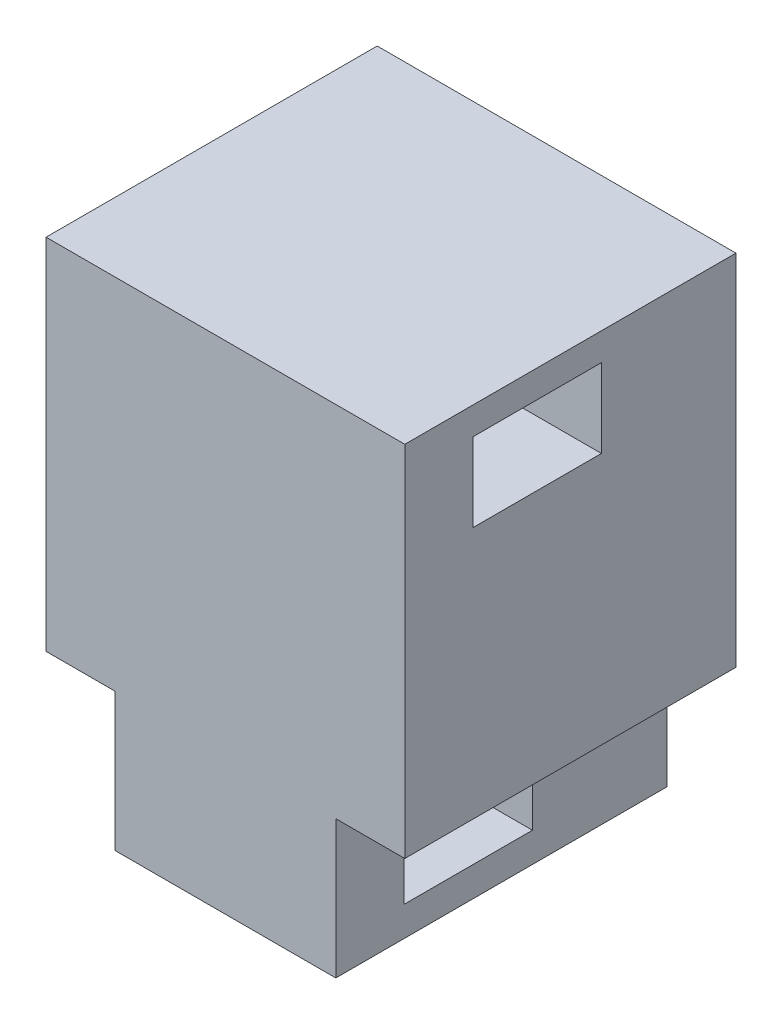
ISO-10303-21;
HEADER;
FILE_DESCRIPTION(('STEP AP214'),'2;1');
FILE_NAME('part.step','',(''),(''),'','','');
FILE_SCHEMA(('AUTOMOTIVE_DESIGN { 1 0 10303 214 1 1 1 1 }'));
ENDSEC;
DATA;
#1=APPLICATION_CONTEXT('core data for automotive mechanical design processes');
#2=APPLICATION_PROTOCOL_DEFINITION('international standard','automotive_design',2000,#1);
#3=PRODUCT_CONTEXT('',#1,'mechanical');
#4=PRODUCT('Part','Part','',(#3));
#5=PRODUCT_RELATED_PRODUCT_CATEGORY('part','',(#4));
#6=PRODUCT_DEFINITION_FORMATION('','',#4);
#7=PRODUCT_DEFINITION_CONTEXT('part definition',#1,'design');
#8=PRODUCT_DEFINITION('design','',#6,#7);
#9=PRODUCT_DEFINITION_SHAPE('','',#8);
#10=(LENGTH_UNIT() NAMED_UNIT(*) SI_UNIT(.MILLI.,.METRE.));
#11=(NAMED_UNIT(*) PLANE_ANGLE_UNIT() SI_UNIT($,.RADIAN.));
#12=(NAMED_UNIT(*) SI_UNIT($,.STERADIAN.) SOLID_ANGLE_UNIT());
#13=UNCERTAINTY_MEASURE_WITH_UNIT(LENGTH_MEASURE(1.E-05),#10,'distance_accuracy_value','');
#14=(GEOMETRIC_REPRESENTATION_CONTEXT(3) GLOBAL_UNCERTAINTY_ASSIGNED_CONTEXT((#13)) GLOBAL_UNIT_ASSIGNED_CONTEXT((#10,
#11,#12)) REPRESENTATION_CONTEXT('',''));
#15=CARTESIAN_POINT('',(0.,0.,0.));
#16=DIRECTION('',(0.,0.,1.));
#17=DIRECTION('',(1.,0.,0.));
#18=AXIS2_PLACEMENT_3D('',#15,#16,#17);
#19=CARTESIAN_POINT('',(65.,-65.,-120.));
#20=DIRECTION('',(1.,0.,0.));
#21=DIRECTION('',(0.,0.,-1.));
#22=AXIS2_PLACEMENT_3D('',#19,#20,#21);
#23=PLANE('',#22);
#24=DIRECTION('',(0.,1.,0.));
#25=VECTOR('',#24,1.);
#26=CARTESIAN_POINT('',(65.,-65.,0.));
#27=LINE('',#26,#25);
#28=CARTESIAN_POINT('',(65.,-65.,0.));
#29=VERTEX_POINT('',#28);
#30=CARTESIAN_POINT('',(65.,65.,0.));
#31=VERTEX_POINT('',#30);
#32=EDGE_CURVE('E410',#29,#31,#27,.T.);
#33=ORIENTED_EDGE('',*,*,#32,.F.);
#34=DIRECTION('',(0.,0.,1.));
#35=VECTOR('',#34,1.);
#36=CARTESIAN_POINT('',(65.,-65.,-120.));
#37=LINE('',#36,#35);
#38=CARTESIAN_POINT('',(65.,-65.,-120.));
#39=VERTEX_POINT('',#38);
#40=EDGE_CURVE('E11',#39,#29,#37,.T.);
#41=ORIENTED_EDGE('',*,*,#40,.F.);
#42=DIRECTION('',(0.,1.,0.));
#43=VECTOR('',#42,1.);
#44=CARTESIAN_POINT('',(65.,-65.,-120.));
#45=LINE('',#44,#43);
#46=CARTESIAN_POINT('',(65.,65.,-120.));
#47=VERTEX_POINT('',#46);
#48=EDGE_CURVE('E421',#39,#47,#45,.T.);
#49=ORIENTED_EDGE('',*,*,#48,.T.);
#50=DIRECTION('',(0.,0.,1.));
#51=VECTOR('',#50,1.);
#52=CARTESIAN_POINT('',(65.,65.,-120.));
#53=LINE('',#52,#51);
#54=EDGE_CURVE('E50',#47,#31,#53,.T.);
#55=ORIENTED_EDGE('',*,*,#54,.T.);
#56=EDGE_LOOP('',(#33,#41,#49,#55));
#57=FACE_BOUND('',#56,.T.);
#58=DIRECTION('',(0.,0.,-1.));
#59=VECTOR('',#58,1.);
#60=CARTESIAN_POINT('',(65.,55.,0.));
#61=LINE('',#60,#59);
#62=CARTESIAN_POINT('',(65.,55.,-24.7500000019928));
#63=VERTEX_POINT('',#62);
#64=CARTESIAN_POINT('',(65.,55.,-71.2500000019928));
#65=VERTEX_POINT('',#64);
#66=EDGE_CURVE('E216',#63,#65,#61,.T.);
#67=ORIENTED_EDGE('',*,*,#66,.T.);
#68=DIRECTION('',(0.,-1.,0.));
#69=VECTOR('',#68,1.);
#70=CARTESIAN_POINT('',(65.,0.,-71.2500000019928));
#71=LINE('',#70,#69);
#72=CARTESIAN_POINT('',(65.,26.5,-71.2500000019928));
#73=VERTEX_POINT('',#72);
#74=EDGE_CURVE('E270',#65,#73,#71,.T.);
#75=ORIENTED_EDGE('',*,*,#74,.T.);
#76=DIRECTION('',(0.,0.,-1.));
#77=VECTOR('',#76,1.);
#78=CARTESIAN_POINT('',(65.,26.5,0.));
#79=LINE('',#78,#77);
#80=CARTESIAN_POINT('',(65.,26.5,-24.7500000019928));
#81=VERTEX_POINT('',#80);
#82=EDGE_CURVE('E288',#81,#73,#79,.T.);
#83=ORIENTED_EDGE('',*,*,#82,.F.);
#84=DIRECTION('',(0.,-1.,0.));
#85=VECTOR('',#84,1.);
#86=CARTESIAN_POINT('',(65.,0.,-24.7500000019928));
#87=LINE('',#86,#85);
#88=EDGE_CURVE('E285',#63,#81,#87,.T.);
#89=ORIENTED_EDGE('',*,*,#88,.F.);
#90=EDGE_LOOP('',(#67,#75,#83,#89));
#91=FACE_BOUND('',#90,.T.);
#92=ADVANCED_FACE('F47',(#57,#91),#23,.T.);
#93=CARTESIAN_POINT('',(40.,0.,-120.));
#94=DIRECTION('',(-1.,0.,0.));
#95=DIRECTION('',(0.,-1.,0.));
#96=AXIS2_PLACEMENT_3D('',#93,#94,#95);
#97=PLANE('',#96);
#98=DIRECTION('',(0.,-1.,0.));
#99=VECTOR('',#98,1.);
#100=CARTESIAN_POINT('',(40.,0.,0.));
#101=LINE('',#100,#99);
#102=CARTESIAN_POINT('',(40.,-65.,0.));
#103=VERTEX_POINT('',#102);
#104=CARTESIAN_POINT('',(40.,-115.,0.));
#105=VERTEX_POINT('',#104);
#106=EDGE_CURVE('E390',#103,#105,#101,.T.);
#107=ORIENTED_EDGE('',*,*,#106,.T.);
#108=DIRECTION('',(0.,0.,1.));
#109=VECTOR('',#108,1.);
#110=CARTESIAN_POINT('',(40.,-115.,-120.));
#111=LINE('',#110,#109);
#112=CARTESIAN_POINT('',(40.,-115.,-120.));
#113=VERTEX_POINT('',#112);
#114=EDGE_CURVE('E411',#113,#105,#111,.T.);
#115=ORIENTED_EDGE('',*,*,#114,.F.);
#116=DIRECTION('',(0.,-1.,0.));
#117=VECTOR('',#116,1.);
#118=CARTESIAN_POINT('',(40.,0.,-120.));
#119=LINE('',#118,#117);
#120=CARTESIAN_POINT('',(40.,-65.,-120.));
#121=VERTEX_POINT('',#120);
#122=EDGE_CURVE('E393',#121,#113,#119,.T.);
#123=ORIENTED_EDGE('',*,*,#122,.F.);
#124=DIRECTION('',(0.,0.,1.));
#125=VECTOR('',#124,1.);
#126=CARTESIAN_POINT('',(40.,-65.,-120.));
#127=LINE('',#126,#125);
#128=EDGE_CURVE('E406',#121,#103,#127,.T.);
#129=ORIENTED_EDGE('',*,*,#128,.T.);
#130=EDGE_LOOP('',(#107,#115,#123,#129));
#131=FACE_BOUND('',#130,.T.);
#132=DIRECTION('',(0.,0.,1.));
#133=VECTOR('',#132,1.);
#134=CARTESIAN_POINT('',(40.,-104.25,0.));
#135=LINE('',#134,#133);
#136=CARTESIAN_POINT('',(40.,-104.25,-71.2500000000002));
#137=VERTEX_POINT('',#136);
#138=CARTESIAN_POINT('',(40.,-104.25,-24.7500000000002));
#139=VERTEX_POINT('',#138);
#140=EDGE_CURVE('E332',#137,#139,#135,.T.);
#141=ORIENTED_EDGE('',*,*,#140,.T.);
#142=DIRECTION('',(0.,-1.,0.));
#143=VECTOR('',#142,1.);
#144=CARTESIAN_POINT('',(40.,0.,-24.7500000000002));
#145=LINE('',#144,#143);
#146=CARTESIAN_POINT('',(40.,-75.7500000000003,-24.7500000000002));
#147=VERTEX_POINT('',#146);
#148=EDGE_CURVE('E346',#147,#139,#145,.T.);
#149=ORIENTED_EDGE('',*,*,#148,.F.);
#150=DIRECTION('',(0.,0.,1.));
#151=VECTOR('',#150,1.);
#152=CARTESIAN_POINT('',(40.,-75.7500000000003,0.));
#153=LINE('',#152,#151);
#154=CARTESIAN_POINT('',(40.,-75.7500000000003,-71.2500000000002));
#155=VERTEX_POINT('',#154);
#156=EDGE_CURVE('E365',#155,#147,#153,.T.);
#157=ORIENTED_EDGE('',*,*,#156,.F.);
#158=DIRECTION('',(0.,-1.,0.));
#159=VECTOR('',#158,1.);
#160=CARTESIAN_POINT('',(40.,0.,-71.2500000000002));
#161=LINE('',#160,#159);
#162=EDGE_CURVE('E361',#155,#137,#161,.T.);
#163=ORIENTED_EDGE('',*,*,#162,.T.);
#164=EDGE_LOOP('',(#141,#149,#157,#163));
#165=FACE_BOUND('',#164,.T.);
#166=ADVANCED_FACE('F495',(#131,#165),#97,.F.);
#167=CARTESIAN_POINT('',(-65.,-65.,-120.));
#168=DIRECTION('',(0.,-1.,0.));
#169=DIRECTION('',(0.,0.,-1.));
#170=AXIS2_PLACEMENT_3D('',#167,#168,#169);
#171=PLANE('',#170);
#172=DIRECTION('',(1.,0.,0.));
#173=VECTOR('',#172,1.);
#174=CARTESIAN_POINT('',(-65.,-65.,-120.));
#175=LINE('',#174,#173);
#176=CARTESIAN_POINT('',(-65.,-65.,-120.));
#177=VERTEX_POINT('',#176);
#178=CARTESIAN_POINT('',(-40.,-65.,-120.));
#179=VERTEX_POINT('',#178);
#180=EDGE_CURVE('E435',#177,#179,#175,.T.);
#181=ORIENTED_EDGE('',*,*,#180,.T.);
#182=DIRECTION('',(0.,0.,1.));
#183=VECTOR('',#182,1.);
#184=CARTESIAN_POINT('',(-40.,-65.,-120.));
#185=LINE('',#184,#183);
#186=CARTESIAN_POINT('',(-40.,-65.,0.));
#187=VERTEX_POINT('',#186);
#188=EDGE_CURVE('E396',#179,#187,#185,.T.);
#189=ORIENTED_EDGE('',*,*,#188,.T.);
#190=DIRECTION('',(1.,0.,0.));
#191=VECTOR('',#190,1.);
#192=CARTESIAN_POINT('',(-65.,-65.,0.));
#193=LINE('',#192,#191);
#194=CARTESIAN_POINT('',(-65.,-65.,0.));
#195=VERTEX_POINT('',#194);
#196=EDGE_CURVE('E426',#195,#187,#193,.T.);
#197=ORIENTED_EDGE('',*,*,#196,.F.);
#198=DIRECTION('',(0.,0.,1.));
#199=VECTOR('',#198,1.);
#200=CARTESIAN_POINT('',(-65.,-65.,-120.));
#201=LINE('',#200,#199);
#202=EDGE_CURVE('E56',#177,#195,#201,.T.);
#203=ORIENTED_EDGE('',*,*,#202,.F.);
#204=EDGE_LOOP('',(#181,#189,#197,#203));
#205=FACE_BOUND('',#204,.T.);
#206=ADVANCED_FACE('F486',(#205),#171,.T.);
#207=ORIENTED_EDGE('',*,*,#128,.F.);
#208=EDGE_CURVE('E434',#121,#39,#175,.T.);
#209=ORIENTED_EDGE('',*,*,#208,.T.);
#210=ORIENTED_EDGE('',*,*,#40,.T.);
#211=EDGE_CURVE('E450',#103,#29,#193,.T.);
#212=ORIENTED_EDGE('',*,*,#211,.F.);
#213=EDGE_LOOP('',(#207,#209,#210,#212));
#214=FACE_BOUND('',#213,.T.);
#215=ADVANCED_FACE('F475',(#214),#171,.T.);
#216=CARTESIAN_POINT('',(-65.,-65.,-120.));
#217=DIRECTION('',(-1.,0.,0.));
#218=DIRECTION('',(0.,0.,1.));
#219=AXIS2_PLACEMENT_3D('',#216,#217,#218);
#220=PLANE('',#219);
#221=DIRECTION('',(0.,-1.,0.));
#222=VECTOR('',#221,1.);
#223=CARTESIAN_POINT('',(-65.,0.,-71.2500000019928));
#224=LINE('',#223,#222);
#225=CARTESIAN_POINT('',(-65.,55.,-71.2500000019928));
#226=VERTEX_POINT('',#225);
#227=CARTESIAN_POINT('',(-65.,26.5,-71.2500000019928));
#228=VERTEX_POINT('',#227);
#229=EDGE_CURVE('E232',#226,#228,#224,.T.);
#230=ORIENTED_EDGE('',*,*,#229,.F.);
#231=DIRECTION('',(0.,0.,-1.));
#232=VECTOR('',#231,1.);
#233=CARTESIAN_POINT('',(-65.,55.,0.));
#234=LINE('',#233,#232);
#235=CARTESIAN_POINT('',(-65.,55.,-24.7500000019928));
#236=VERTEX_POINT('',#235);
#237=EDGE_CURVE('E246',#236,#226,#234,.T.);
#238=ORIENTED_EDGE('',*,*,#237,.F.);
#239=DIRECTION('',(0.,-1.,0.));
#240=VECTOR('',#239,1.);
#241=CARTESIAN_POINT('',(-65.,0.,-24.7500000019928));
#242=LINE('',#241,#240);
#243=CARTESIAN_POINT('',(-65.,26.5,-24.7500000019928));
#244=VERTEX_POINT('',#243);
#245=EDGE_CURVE('E260',#236,#244,#242,.T.);
#246=ORIENTED_EDGE('',*,*,#245,.T.);
#247=DIRECTION('',(0.,0.,-1.));
#248=VECTOR('',#247,1.);
#249=CARTESIAN_POINT('',(-65.,26.5,0.));
#250=LINE('',#249,#248);
#251=EDGE_CURVE('E236',#244,#228,#250,.T.);
#252=ORIENTED_EDGE('',*,*,#251,.T.);
#253=EDGE_LOOP('',(#230,#238,#246,#252));
#254=FACE_BOUND('',#253,.T.);
#255=DIRECTION('',(0.,-1.,0.));
#256=VECTOR('',#255,1.);
#257=CARTESIAN_POINT('',(-65.,-65.,0.));
#258=LINE('',#257,#256);
#259=CARTESIAN_POINT('',(-65.,65.,0.));
#260=VERTEX_POINT('',#259);
#261=EDGE_CURVE('E446',#260,#195,#258,.T.);
#262=ORIENTED_EDGE('',*,*,#261,.F.);
#263=DIRECTION('',(0.,0.,1.));
#264=VECTOR('',#263,1.);
#265=CARTESIAN_POINT('',(-65.,65.,-120.));
#266=LINE('',#265,#264);
#267=CARTESIAN_POINT('',(-65.,65.,-120.));
#268=VERTEX_POINT('',#267);
#269=EDGE_CURVE('E455',#268,#260,#266,.T.);
#270=ORIENTED_EDGE('',*,*,#269,.F.);
#271=DIRECTION('',(0.,-1.,0.));
#272=VECTOR('',#271,1.);
#273=CARTESIAN_POINT('',(-65.,-65.,-120.));
#274=LINE('',#273,#272);
#275=EDGE_CURVE('E430',#268,#177,#274,.T.);
#276=ORIENTED_EDGE('',*,*,#275,.T.);
#277=ORIENTED_EDGE('',*,*,#202,.T.);
#278=EDGE_LOOP('',(#262,#270,#276,#277));
#279=FACE_BOUND('',#278,.T.);
#280=ADVANCED_FACE('F483',(#254,#279),#220,.T.);
#281=CARTESIAN_POINT('',(-65.,65.,-120.));
#282=DIRECTION('',(0.,1.,0.));
#283=DIRECTION('',(0.,0.,1.));
#284=AXIS2_PLACEMENT_3D('',#281,#282,#283);
#285=PLANE('',#284);
#286=DIRECTION('',(-1.,0.,0.));
#287=VECTOR('',#286,1.);
#288=CARTESIAN_POINT('',(-65.,65.,0.));
#289=LINE('',#288,#287);
#290=EDGE_CURVE('E442',#31,#260,#289,.T.);
#291=ORIENTED_EDGE('',*,*,#290,.F.);
#292=ORIENTED_EDGE('',*,*,#54,.F.);
#293=DIRECTION('',(-1.,0.,0.));
#294=VECTOR('',#293,1.);
#295=CARTESIAN_POINT('',(-65.,65.,-120.));
#296=LINE('',#295,#294);
#297=EDGE_CURVE('E425',#47,#268,#296,.T.);
#298=ORIENTED_EDGE('',*,*,#297,.T.);
#299=ORIENTED_EDGE('',*,*,#269,.T.);
#300=EDGE_LOOP('',(#291,#292,#298,#299));
#301=FACE_BOUND('',#300,.T.);
#302=ADVANCED_FACE('F467',(#301),#285,.T.);
#303=CARTESIAN_POINT('',(0.,0.,-120.));
#304=DIRECTION('',(0.,0.,-1.));
#305=DIRECTION('',(-1.,0.,0.));
#306=AXIS2_PLACEMENT_3D('',#303,#304,#305);
#307=PLANE('',#306);
#308=ORIENTED_EDGE('',*,*,#48,.F.);
#309=ORIENTED_EDGE('',*,*,#208,.F.);
#310=ORIENTED_EDGE('',*,*,#122,.T.);
#311=DIRECTION('',(-1.,0.,0.));
#312=VECTOR('',#311,1.);
#313=CARTESIAN_POINT('',(0.,-115.,-120.));
#314=LINE('',#313,#312);
#315=CARTESIAN_POINT('',(-40.,-115.,-120.));
#316=VERTEX_POINT('',#315);
#317=EDGE_CURVE('E389',#113,#316,#314,.T.);
#318=ORIENTED_EDGE('',*,*,#317,.T.);
#319=DIRECTION('',(0.,-1.,0.));
#320=VECTOR('',#319,1.);
#321=CARTESIAN_POINT('',(-40.,0.,-120.));
#322=LINE('',#321,#320);
#323=EDGE_CURVE('E385',#179,#316,#322,.T.);
#324=ORIENTED_EDGE('',*,*,#323,.F.);
#325=ORIENTED_EDGE('',*,*,#180,.F.);
#326=ORIENTED_EDGE('',*,*,#275,.F.);
#327=ORIENTED_EDGE('',*,*,#297,.F.);
#328=EDGE_LOOP('',(#308,#309,#310,#318,#324,#325,#326,#327));
#329=FACE_BOUND('',#328,.T.);
#330=ADVANCED_FACE('F478',(#329),#307,.T.);
#331=CARTESIAN_POINT('',(0.,0.,0.));
#332=DIRECTION('',(0.,0.,-1.));
#333=DIRECTION('',(-1.,0.,0.));
#334=AXIS2_PLACEMENT_3D('',#331,#332,#333);
#335=PLANE('',#334);
#336=ORIENTED_EDGE('',*,*,#32,.T.);
#337=ORIENTED_EDGE('',*,*,#290,.T.);
#338=ORIENTED_EDGE('',*,*,#261,.T.);
#339=ORIENTED_EDGE('',*,*,#196,.T.);
#340=DIRECTION('',(0.,-1.,0.));
#341=VECTOR('',#340,1.);
#342=CARTESIAN_POINT('',(-40.,0.,0.));
#343=LINE('',#342,#341);
#344=CARTESIAN_POINT('',(-40.,-115.,0.));
#345=VERTEX_POINT('',#344);
#346=EDGE_CURVE('E375',#187,#345,#343,.T.);
#347=ORIENTED_EDGE('',*,*,#346,.T.);
#348=DIRECTION('',(-1.,0.,0.));
#349=VECTOR('',#348,1.);
#350=CARTESIAN_POINT('',(0.,-115.,0.));
#351=LINE('',#350,#349);
#352=EDGE_CURVE('E400',#105,#345,#351,.T.);
#353=ORIENTED_EDGE('',*,*,#352,.F.);
#354=ORIENTED_EDGE('',*,*,#106,.F.);
#355=ORIENTED_EDGE('',*,*,#211,.T.);
#356=EDGE_LOOP('',(#336,#337,#338,#339,#347,#353,#354,#355));
#357=FACE_BOUND('',#356,.T.);
#358=ADVANCED_FACE('F469',(#357),#335,.F.);
#359=CARTESIAN_POINT('',(0.,-115.,-120.));
#360=DIRECTION('',(0.,1.,0.));
#361=DIRECTION('',(0.,0.,1.));
#362=AXIS2_PLACEMENT_3D('',#359,#360,#361);
#363=PLANE('',#362);
#364=ORIENTED_EDGE('',*,*,#352,.T.);
#365=DIRECTION('',(0.,0.,1.));
#366=VECTOR('',#365,1.);
#367=CARTESIAN_POINT('',(-40.,-115.,-120.));
#368=LINE('',#367,#366);
#369=EDGE_CURVE('E415',#316,#345,#368,.T.);
#370=ORIENTED_EDGE('',*,*,#369,.F.);
#371=ORIENTED_EDGE('',*,*,#317,.F.);
#372=ORIENTED_EDGE('',*,*,#114,.T.);
#373=EDGE_LOOP('',(#364,#370,#371,#372));
#374=FACE_BOUND('',#373,.T.);
#375=ADVANCED_FACE('F493',(#374),#363,.F.);
#376=CARTESIAN_POINT('',(-40.,0.,-120.));
#377=DIRECTION('',(-1.,0.,0.));
#378=DIRECTION('',(0.,-1.,0.));
#379=AXIS2_PLACEMENT_3D('',#376,#377,#378);
#380=PLANE('',#379);
#381=DIRECTION('',(0.,0.,1.));
#382=VECTOR('',#381,1.);
#383=CARTESIAN_POINT('',(-40.,-104.25,0.));
#384=LINE('',#383,#382);
#385=CARTESIAN_POINT('',(-40.,-104.25,-71.2500000000002));
#386=VERTEX_POINT('',#385);
#387=CARTESIAN_POINT('',(-40.,-104.25,-24.7500000000002));
#388=VERTEX_POINT('',#387);
#389=EDGE_CURVE('E295',#386,#388,#384,.T.);
#390=ORIENTED_EDGE('',*,*,#389,.F.);
#391=DIRECTION('',(0.,-1.,0.));
#392=VECTOR('',#391,1.);
#393=CARTESIAN_POINT('',(-40.,0.,-71.2500000000002));
#394=LINE('',#393,#392);
#395=CARTESIAN_POINT('',(-40.,-75.7500000000003,-71.2500000000002));
#396=VERTEX_POINT('',#395);
#397=EDGE_CURVE('E305',#396,#386,#394,.T.);
#398=ORIENTED_EDGE('',*,*,#397,.F.);
#399=DIRECTION('',(0.,0.,1.));
#400=VECTOR('',#399,1.);
#401=CARTESIAN_POINT('',(-40.,-75.7500000000003,0.));
#402=LINE('',#401,#400);
#403=CARTESIAN_POINT('',(-40.,-75.7500000000003,-24.7500000000002));
#404=VERTEX_POINT('',#403);
#405=EDGE_CURVE('E322',#396,#404,#402,.T.);
#406=ORIENTED_EDGE('',*,*,#405,.T.);
#407=DIRECTION('',(0.,-1.,0.));
#408=VECTOR('',#407,1.);
#409=CARTESIAN_POINT('',(-40.,0.,-24.7500000000002));
#410=LINE('',#409,#408);
#411=EDGE_CURVE('E318',#404,#388,#410,.T.);
#412=ORIENTED_EDGE('',*,*,#411,.T.);
#413=EDGE_LOOP('',(#390,#398,#406,#412));
#414=FACE_BOUND('',#413,.T.);
#415=ORIENTED_EDGE('',*,*,#346,.F.);
#416=ORIENTED_EDGE('',*,*,#188,.F.);
#417=ORIENTED_EDGE('',*,*,#323,.T.);
#418=ORIENTED_EDGE('',*,*,#369,.T.);
#419=EDGE_LOOP('',(#415,#416,#417,#418));
#420=FACE_BOUND('',#419,.T.);
#421=ADVANCED_FACE('F488',(#414,#420),#380,.T.);
#422=CARTESIAN_POINT('',(6.00000000000001,-104.25,0.));
#423=DIRECTION('',(0.,1.,0.));
#424=DIRECTION('',(-1.,0.,0.));
#425=AXIS2_PLACEMENT_3D('',#422,#423,#424);
#426=PLANE('',#425);
#427=ORIENTED_EDGE('',*,*,#140,.F.);
#428=DIRECTION('',(1.,0.,0.));
#429=VECTOR('',#428,1.);
#430=CARTESIAN_POINT('',(6.00000000000001,-104.25,-71.2500000000002));
#431=LINE('',#430,#429);
#432=CARTESIAN_POINT('',(6.00000000000001,-104.25,-71.2500000000002));
#433=VERTEX_POINT('',#432);
#434=EDGE_CURVE('E357',#433,#137,#431,.T.);
#435=ORIENTED_EDGE('',*,*,#434,.F.);
#436=DIRECTION('',(0.,0.,1.));
#437=VECTOR('',#436,1.);
#438=CARTESIAN_POINT('',(6.00000000000001,-104.25,0.));
#439=LINE('',#438,#437);
#440=CARTESIAN_POINT('',(6.00000000000001,-104.25,-24.7500000000002));
#441=VERTEX_POINT('',#440);
#442=EDGE_CURVE('E342',#433,#441,#439,.T.);
#443=ORIENTED_EDGE('',*,*,#442,.T.);
#444=DIRECTION('',(1.,0.,0.));
#445=VECTOR('',#444,1.);
#446=CARTESIAN_POINT('',(6.00000000000001,-104.25,-24.7500000000002));
#447=LINE('',#446,#445);
#448=EDGE_CURVE('E372',#441,#139,#447,.T.);
#449=ORIENTED_EDGE('',*,*,#448,.T.);
#450=EDGE_LOOP('',(#427,#435,#443,#449));
#451=FACE_BOUND('',#450,.T.);
#452=ADVANCED_FACE('F504',(#451),#426,.T.);
#453=CARTESIAN_POINT('',(5.99999999999998,0.,-24.7500000000002));
#454=DIRECTION('',(0.,0.,1.));
#455=DIRECTION('',(1.,0.,0.));
#456=AXIS2_PLACEMENT_3D('',#453,#454,#455);
#457=PLANE('',#456);
#458=ORIENTED_EDGE('',*,*,#148,.T.);
#459=ORIENTED_EDGE('',*,*,#448,.F.);
#460=DIRECTION('',(0.,-1.,0.));
#461=VECTOR('',#460,1.);
#462=CARTESIAN_POINT('',(5.99999999999998,0.,-24.7500000000002));
#463=LINE('',#462,#461);
#464=CARTESIAN_POINT('',(6.00000000000001,-75.7500000000004,-24.7500000000002));
#465=VERTEX_POINT('',#464);
#466=EDGE_CURVE('E353',#465,#441,#463,.T.);
#467=ORIENTED_EDGE('',*,*,#466,.F.);
#468=DIRECTION('',(1.,0.,0.));
#469=VECTOR('',#468,1.);
#470=CARTESIAN_POINT('',(6.00000000000001,-75.7500000000004,-24.7500000000002));
#471=LINE('',#470,#469);
#472=EDGE_CURVE('E376',#465,#147,#471,.T.);
#473=ORIENTED_EDGE('',*,*,#472,.T.);
#474=EDGE_LOOP('',(#458,#459,#467,#473));
#475=FACE_BOUND('',#474,.T.);
#476=ADVANCED_FACE('F517',(#475),#457,.F.);
#477=CARTESIAN_POINT('',(6.00000000000001,-75.7500000000004,0.));
#478=DIRECTION('',(0.,1.,0.));
#479=DIRECTION('',(-1.,0.,0.));
#480=AXIS2_PLACEMENT_3D('',#477,#478,#479);
#481=PLANE('',#480);
#482=ORIENTED_EDGE('',*,*,#156,.T.);
#483=ORIENTED_EDGE('',*,*,#472,.F.);
#484=DIRECTION('',(0.,0.,1.));
#485=VECTOR('',#484,1.);
#486=CARTESIAN_POINT('',(6.00000000000001,-75.7500000000004,0.));
#487=LINE('',#486,#485);
#488=CARTESIAN_POINT('',(6.00000000000001,-75.7500000000004,-71.2500000000002));
#489=VERTEX_POINT('',#488);
#490=EDGE_CURVE('E349',#489,#465,#487,.T.);
#491=ORIENTED_EDGE('',*,*,#490,.F.);
#492=DIRECTION('',(1.,0.,0.));
#493=VECTOR('',#492,1.);
#494=CARTESIAN_POINT('',(6.00000000000001,-75.7500000000004,-71.2500000000002));
#495=LINE('',#494,#493);
#496=EDGE_CURVE('E379',#489,#155,#495,.T.);
#497=ORIENTED_EDGE('',*,*,#496,.T.);
#498=EDGE_LOOP('',(#482,#483,#491,#497));
#499=FACE_BOUND('',#498,.T.);
#500=ADVANCED_FACE('F515',(#499),#481,.F.);
#501=CARTESIAN_POINT('',(5.99999999999998,0.,-71.2500000000002));
#502=DIRECTION('',(0.,0.,1.));
#503=DIRECTION('',(1.,0.,0.));
#504=AXIS2_PLACEMENT_3D('',#501,#502,#503);
#505=PLANE('',#504);
#506=ORIENTED_EDGE('',*,*,#162,.F.);
#507=ORIENTED_EDGE('',*,*,#496,.F.);
#508=DIRECTION('',(0.,-1.,0.));
#509=VECTOR('',#508,1.);
#510=CARTESIAN_POINT('',(5.99999999999998,0.,-71.2500000000002));
#511=LINE('',#510,#509);
#512=EDGE_CURVE('E345',#489,#433,#511,.T.);
#513=ORIENTED_EDGE('',*,*,#512,.T.);
#514=ORIENTED_EDGE('',*,*,#434,.T.);
#515=EDGE_LOOP('',(#506,#507,#513,#514));
#516=FACE_BOUND('',#515,.T.);
#517=ADVANCED_FACE('F508',(#516),#505,.T.);
#518=CARTESIAN_POINT('',(5.99999999999998,0.,0.));
#519=DIRECTION('',(1.,0.,0.));
#520=DIRECTION('',(0.,1.,0.));
#521=AXIS2_PLACEMENT_3D('',#518,#519,#520);
#522=PLANE('',#521);
#523=ORIENTED_EDGE('',*,*,#442,.F.);
#524=ORIENTED_EDGE('',*,*,#512,.F.);
#525=ORIENTED_EDGE('',*,*,#490,.T.);
#526=ORIENTED_EDGE('',*,*,#466,.T.);
#527=EDGE_LOOP('',(#523,#524,#525,#526));
#528=FACE_BOUND('',#527,.T.);
#529=ADVANCED_FACE('F512',(#528),#522,.T.);
#530=CARTESIAN_POINT('',(-6.00000000000001,-104.25,0.));
#531=DIRECTION('',(0.,-1.,0.));
#532=DIRECTION('',(1.,0.,0.));
#533=AXIS2_PLACEMENT_3D('',#530,#531,#532);
#534=PLANE('',#533);
#535=ORIENTED_EDGE('',*,*,#389,.T.);
#536=DIRECTION('',(-1.,0.,0.));
#537=VECTOR('',#536,1.);
#538=CARTESIAN_POINT('',(-6.00000000000001,-104.25,-24.7500000000002));
#539=LINE('',#538,#537);
#540=CARTESIAN_POINT('',(-6.00000000000001,-104.25,-24.7500000000002));
#541=VERTEX_POINT('',#540);
#542=EDGE_CURVE('E315',#541,#388,#539,.T.);
#543=ORIENTED_EDGE('',*,*,#542,.F.);
#544=DIRECTION('',(0.,0.,1.));
#545=VECTOR('',#544,1.);
#546=CARTESIAN_POINT('',(-6.00000000000001,-104.25,0.));
#547=LINE('',#546,#545);
#548=CARTESIAN_POINT('',(-6.00000000000001,-104.25,-71.2500000000002));
#549=VERTEX_POINT('',#548);
#550=EDGE_CURVE('E300',#549,#541,#547,.T.);
#551=ORIENTED_EDGE('',*,*,#550,.F.);
#552=DIRECTION('',(-1.,0.,0.));
#553=VECTOR('',#552,1.);
#554=CARTESIAN_POINT('',(-6.00000000000001,-104.25,-71.2500000000002));
#555=LINE('',#554,#553);
#556=EDGE_CURVE('E329',#549,#386,#555,.T.);
#557=ORIENTED_EDGE('',*,*,#556,.T.);
#558=EDGE_LOOP('',(#535,#543,#551,#557));
#559=FACE_BOUND('',#558,.T.);
#560=ADVANCED_FACE('F687',(#559),#534,.F.);
#561=CARTESIAN_POINT('',(-5.99999999999998,0.,-71.2500000000002));
#562=DIRECTION('',(0.,0.,-1.));
#563=DIRECTION('',(-1.,0.,0.));
#564=AXIS2_PLACEMENT_3D('',#561,#562,#563);
#565=PLANE('',#564);
#566=ORIENTED_EDGE('',*,*,#397,.T.);
#567=ORIENTED_EDGE('',*,*,#556,.F.);
#568=DIRECTION('',(0.,-1.,0.));
#569=VECTOR('',#568,1.);
#570=CARTESIAN_POINT('',(-5.99999999999998,0.,-71.2500000000002));
#571=LINE('',#570,#569);
#572=CARTESIAN_POINT('',(-6.00000000000001,-75.7500000000004,-71.2500000000002));
#573=VERTEX_POINT('',#572);
#574=EDGE_CURVE('E311',#573,#549,#571,.T.);
#575=ORIENTED_EDGE('',*,*,#574,.F.);
#576=DIRECTION('',(-1.,0.,0.));
#577=VECTOR('',#576,1.);
#578=CARTESIAN_POINT('',(-6.00000000000001,-75.7500000000004,-71.2500000000002));
#579=LINE('',#578,#577);
#580=EDGE_CURVE('E333',#573,#396,#579,.T.);
#581=ORIENTED_EDGE('',*,*,#580,.T.);
#582=EDGE_LOOP('',(#566,#567,#575,#581));
#583=FACE_BOUND('',#582,.T.);
#584=ADVANCED_FACE('F678',(#583),#565,.F.);
#585=CARTESIAN_POINT('',(-6.00000000000001,-75.7500000000004,0.));
#586=DIRECTION('',(0.,-1.,0.));
#587=DIRECTION('',(1.,0.,0.));
#588=AXIS2_PLACEMENT_3D('',#585,#586,#587);
#589=PLANE('',#588);
#590=ORIENTED_EDGE('',*,*,#405,.F.);
#591=ORIENTED_EDGE('',*,*,#580,.F.);
#592=DIRECTION('',(0.,0.,1.));
#593=VECTOR('',#592,1.);
#594=CARTESIAN_POINT('',(-6.00000000000001,-75.7500000000004,0.));
#595=LINE('',#594,#593);
#596=CARTESIAN_POINT('',(-6.00000000000001,-75.7500000000004,-24.7500000000002));
#597=VERTEX_POINT('',#596);
#598=EDGE_CURVE('E308',#573,#597,#595,.T.);
#599=ORIENTED_EDGE('',*,*,#598,.T.);
#600=DIRECTION('',(-1.,0.,0.));
#601=VECTOR('',#600,1.);
#602=CARTESIAN_POINT('',(-6.00000000000001,-75.7500000000004,-24.7500000000002));
#603=LINE('',#602,#601);
#604=EDGE_CURVE('E336',#597,#404,#603,.T.);
#605=ORIENTED_EDGE('',*,*,#604,.T.);
#606=EDGE_LOOP('',(#590,#591,#599,#605));
#607=FACE_BOUND('',#606,.T.);
#608=ADVANCED_FACE('F668',(#607),#589,.T.);
#609=CARTESIAN_POINT('',(-5.99999999999998,0.,-24.7500000000002));
#610=DIRECTION('',(0.,0.,-1.));
#611=DIRECTION('',(-1.,0.,0.));
#612=AXIS2_PLACEMENT_3D('',#609,#610,#611);
#613=PLANE('',#612);
#614=ORIENTED_EDGE('',*,*,#411,.F.);
#615=ORIENTED_EDGE('',*,*,#604,.F.);
#616=DIRECTION('',(0.,-1.,0.));
#617=VECTOR('',#616,1.);
#618=CARTESIAN_POINT('',(-5.99999999999998,0.,-24.7500000000002));
#619=LINE('',#618,#617);
#620=EDGE_CURVE('E304',#597,#541,#619,.T.);
#621=ORIENTED_EDGE('',*,*,#620,.T.);
#622=ORIENTED_EDGE('',*,*,#542,.T.);
#623=EDGE_LOOP('',(#614,#615,#621,#622));
#624=FACE_BOUND('',#623,.T.);
#625=ADVANCED_FACE('F660',(#624),#613,.T.);
#626=CARTESIAN_POINT('',(-5.99999999999998,0.,0.));
#627=DIRECTION('',(-1.,0.,0.));
#628=DIRECTION('',(0.,1.,0.));
#629=AXIS2_PLACEMENT_3D('',#626,#627,#628);
#630=PLANE('',#629);
#631=ORIENTED_EDGE('',*,*,#550,.T.);
#632=ORIENTED_EDGE('',*,*,#620,.F.);
#633=ORIENTED_EDGE('',*,*,#598,.F.);
#634=ORIENTED_EDGE('',*,*,#574,.T.);
#635=EDGE_LOOP('',(#631,#632,#633,#634));
#636=FACE_BOUND('',#635,.T.);
#637=ADVANCED_FACE('F536',(#636),#630,.T.);
#638=CARTESIAN_POINT('',(31.,0.,-71.2500000019928));
#639=DIRECTION('',(0.,0.,1.));
#640=DIRECTION('',(0.,-1.,0.));
#641=AXIS2_PLACEMENT_3D('',#638,#639,#640);
#642=PLANE('',#641);
#643=DIRECTION('',(0.,1.,0.));
#644=VECTOR('',#643,1.);
#645=CARTESIAN_POINT('',(31.,55.,-71.2500000019928));
#646=LINE('',#645,#644);
#647=CARTESIAN_POINT('',(31.,26.5,-71.2500000019928));
#648=VERTEX_POINT('',#647);
#649=CARTESIAN_POINT('',(31.,55.,-71.2500000019928));
#650=VERTEX_POINT('',#649);
#651=EDGE_CURVE('E64',#648,#650,#646,.T.);
#652=ORIENTED_EDGE('',*,*,#651,.F.);
#653=DIRECTION('',(1.,0.,0.));
#654=VECTOR('',#653,1.);
#655=CARTESIAN_POINT('',(31.,26.5,-71.2500000019928));
#656=LINE('',#655,#654);
#657=EDGE_CURVE('E292',#648,#73,#656,.T.);
#658=ORIENTED_EDGE('',*,*,#657,.T.);
#659=ORIENTED_EDGE('',*,*,#74,.F.);
#660=DIRECTION('',(1.,0.,0.));
#661=VECTOR('',#660,1.);
#662=CARTESIAN_POINT('',(31.,55.,-71.2500000019928));
#663=LINE('',#662,#661);
#664=EDGE_CURVE('E222',#650,#65,#663,.T.);
#665=ORIENTED_EDGE('',*,*,#664,.F.);
#666=EDGE_LOOP('',(#652,#658,#659,#665));
#667=FACE_BOUND('',#666,.T.);
#668=ADVANCED_FACE('F597',(#667),#642,.T.);
#669=CARTESIAN_POINT('',(31.,26.5,0.));
#670=DIRECTION('',(0.,-1.,0.));
#671=DIRECTION('',(0.,0.,-1.));
#672=AXIS2_PLACEMENT_3D('',#669,#670,#671);
#673=PLANE('',#672);
#674=ORIENTED_EDGE('',*,*,#657,.F.);
#675=DIRECTION('',(0.,0.,-1.));
#676=VECTOR('',#675,1.);
#677=CARTESIAN_POINT('',(31.,26.5,-24.7500000019928));
#678=LINE('',#677,#676);
#679=CARTESIAN_POINT('',(31.,26.5,-24.7500000019928));
#680=VERTEX_POINT('',#679);
#681=EDGE_CURVE('E71',#680,#648,#678,.T.);
#682=ORIENTED_EDGE('',*,*,#681,.F.);
#683=DIRECTION('',(1.,0.,0.));
#684=VECTOR('',#683,1.);
#685=CARTESIAN_POINT('',(31.,26.5,-24.7500000019928));
#686=LINE('',#685,#684);
#687=EDGE_CURVE('E221',#680,#81,#686,.T.);
#688=ORIENTED_EDGE('',*,*,#687,.T.);
#689=ORIENTED_EDGE('',*,*,#82,.T.);
#690=EDGE_LOOP('',(#674,#682,#688,#689));
#691=FACE_BOUND('',#690,.T.);
#692=ADVANCED_FACE('F601',(#691),#673,.F.);
#693=CARTESIAN_POINT('',(31.,0.,-24.7500000019928));
#694=DIRECTION('',(0.,0.,1.));
#695=DIRECTION('',(0.,-1.,0.));
#696=AXIS2_PLACEMENT_3D('',#693,#694,#695);
#697=PLANE('',#696);
#698=ORIENTED_EDGE('',*,*,#687,.F.);
#699=DIRECTION('',(0.,-1.,0.));
#700=VECTOR('',#699,1.);
#701=CARTESIAN_POINT('',(31.,55.,-24.7500000019928));
#702=LINE('',#701,#700);
#703=CARTESIAN_POINT('',(31.,55.,-24.7500000019928));
#704=VERTEX_POINT('',#703);
#705=EDGE_CURVE('E225',#704,#680,#702,.T.);
#706=ORIENTED_EDGE('',*,*,#705,.F.);
#707=DIRECTION('',(1.,0.,0.));
#708=VECTOR('',#707,1.);
#709=CARTESIAN_POINT('',(31.,55.,-24.7500000019928));
#710=LINE('',#709,#708);
#711=EDGE_CURVE('E210',#704,#63,#710,.T.);
#712=ORIENTED_EDGE('',*,*,#711,.T.);
#713=ORIENTED_EDGE('',*,*,#88,.T.);
#714=EDGE_LOOP('',(#698,#706,#712,#713));
#715=FACE_BOUND('',#714,.T.);
#716=ADVANCED_FACE('F226',(#715),#697,.F.);
#717=CARTESIAN_POINT('',(31.,55.,0.));
#718=DIRECTION('',(0.,-1.,0.));
#719=DIRECTION('',(0.,0.,-1.));
#720=AXIS2_PLACEMENT_3D('',#717,#718,#719);
#721=PLANE('',#720);
#722=DIRECTION('',(0.,0.,1.));
#723=VECTOR('',#722,1.);
#724=CARTESIAN_POINT('',(31.,55.,-24.7500000019928));
#725=LINE('',#724,#723);
#726=EDGE_CURVE('E214',#650,#704,#725,.T.);
#727=ORIENTED_EDGE('',*,*,#726,.F.);
#728=ORIENTED_EDGE('',*,*,#664,.T.);
#729=ORIENTED_EDGE('',*,*,#66,.F.);
#730=ORIENTED_EDGE('',*,*,#711,.F.);
#731=EDGE_LOOP('',(#727,#728,#729,#730));
#732=FACE_BOUND('',#731,.T.);
#733=ADVANCED_FACE('F212',(#732),#721,.T.);
#734=CARTESIAN_POINT('',(-31.,0.,-71.2500000019928));
#735=DIRECTION('',(0.,0.,-1.));
#736=DIRECTION('',(0.,1.,0.));
#737=AXIS2_PLACEMENT_3D('',#734,#735,#736);
#738=PLANE('',#737);
#739=ORIENTED_EDGE('',*,*,#229,.T.);
#740=DIRECTION('',(-1.,0.,0.));
#741=VECTOR('',#740,1.);
#742=CARTESIAN_POINT('',(-31.,26.5,-71.2500000019928));
#743=LINE('',#742,#741);
#744=CARTESIAN_POINT('',(-31.,26.5,-71.2500000019928));
#745=VERTEX_POINT('',#744);
#746=EDGE_CURVE('E255',#745,#228,#743,.T.);
#747=ORIENTED_EDGE('',*,*,#746,.F.);
#748=DIRECTION('',(0.,-1.,0.));
#749=VECTOR('',#748,1.);
#750=CARTESIAN_POINT('',(-31.,0.,-71.2500000019928));
#751=LINE('',#750,#749);
#752=CARTESIAN_POINT('',(-31.,55.,-71.2500000019928));
#753=VERTEX_POINT('',#752);
#754=EDGE_CURVE('E241',#753,#745,#751,.T.);
#755=ORIENTED_EDGE('',*,*,#754,.F.);
#756=DIRECTION('',(-1.,0.,0.));
#757=VECTOR('',#756,1.);
#758=CARTESIAN_POINT('',(-31.,55.,-71.2500000019928));
#759=LINE('',#758,#757);
#760=EDGE_CURVE('E267',#753,#226,#759,.T.);
#761=ORIENTED_EDGE('',*,*,#760,.T.);
#762=EDGE_LOOP('',(#739,#747,#755,#761));
#763=FACE_BOUND('',#762,.T.);
#764=ADVANCED_FACE('F550',(#763),#738,.F.);
#765=CARTESIAN_POINT('',(-31.,55.,0.));
#766=DIRECTION('',(0.,1.,0.));
#767=DIRECTION('',(0.,0.,1.));
#768=AXIS2_PLACEMENT_3D('',#765,#766,#767);
#769=PLANE('',#768);
#770=ORIENTED_EDGE('',*,*,#237,.T.);
#771=ORIENTED_EDGE('',*,*,#760,.F.);
#772=DIRECTION('',(0.,0.,-1.));
#773=VECTOR('',#772,1.);
#774=CARTESIAN_POINT('',(-31.,55.,0.));
#775=LINE('',#774,#773);
#776=CARTESIAN_POINT('',(-31.,55.,-24.7500000019928));
#777=VERTEX_POINT('',#776);
#778=EDGE_CURVE('E252',#777,#753,#775,.T.);
#779=ORIENTED_EDGE('',*,*,#778,.F.);
#780=DIRECTION('',(-1.,0.,0.));
#781=VECTOR('',#780,1.);
#782=CARTESIAN_POINT('',(-31.,55.,-24.7500000019928));
#783=LINE('',#782,#781);
#784=EDGE_CURVE('E271',#777,#236,#783,.T.);
#785=ORIENTED_EDGE('',*,*,#784,.T.);
#786=EDGE_LOOP('',(#770,#771,#779,#785));
#787=FACE_BOUND('',#786,.T.);
#788=ADVANCED_FACE('F554',(#787),#769,.F.);
#789=CARTESIAN_POINT('',(-31.,0.,-24.7500000019928));
#790=DIRECTION('',(0.,0.,-1.));
#791=DIRECTION('',(0.,1.,0.));
#792=AXIS2_PLACEMENT_3D('',#789,#790,#791);
#793=PLANE('',#792);
#794=ORIENTED_EDGE('',*,*,#245,.F.);
#795=ORIENTED_EDGE('',*,*,#784,.F.);
#796=DIRECTION('',(0.,-1.,0.));
#797=VECTOR('',#796,1.);
#798=CARTESIAN_POINT('',(-31.,0.,-24.7500000019928));
#799=LINE('',#798,#797);
#800=CARTESIAN_POINT('',(-31.,26.5,-24.7500000019928));
#801=VERTEX_POINT('',#800);
#802=EDGE_CURVE('E249',#777,#801,#799,.T.);
#803=ORIENTED_EDGE('',*,*,#802,.T.);
#804=DIRECTION('',(-1.,0.,0.));
#805=VECTOR('',#804,1.);
#806=CARTESIAN_POINT('',(-31.,26.5,-24.7500000019928));
#807=LINE('',#806,#805);
#808=EDGE_CURVE('E274',#801,#244,#807,.T.);
#809=ORIENTED_EDGE('',*,*,#808,.T.);
#810=EDGE_LOOP('',(#794,#795,#803,#809));
#811=FACE_BOUND('',#810,.T.);
#812=ADVANCED_FACE('F564',(#811),#793,.T.);
#813=CARTESIAN_POINT('',(-31.,26.5,0.));
#814=DIRECTION('',(0.,1.,0.));
#815=DIRECTION('',(0.,0.,1.));
#816=AXIS2_PLACEMENT_3D('',#813,#814,#815);
#817=PLANE('',#816);
#818=ORIENTED_EDGE('',*,*,#251,.F.);
#819=ORIENTED_EDGE('',*,*,#808,.F.);
#820=DIRECTION('',(0.,0.,-1.));
#821=VECTOR('',#820,1.);
#822=CARTESIAN_POINT('',(-31.,26.5,0.));
#823=LINE('',#822,#821);
#824=EDGE_CURVE('E245',#801,#745,#823,.T.);
#825=ORIENTED_EDGE('',*,*,#824,.T.);
#826=ORIENTED_EDGE('',*,*,#746,.T.);
#827=EDGE_LOOP('',(#818,#819,#825,#826));
#828=FACE_BOUND('',#827,.T.);
#829=ADVANCED_FACE('F573',(#828),#817,.T.);
#830=CARTESIAN_POINT('',(-31.,0.,0.));
#831=DIRECTION('',(-1.,0.,0.));
#832=DIRECTION('',(0.,0.,-1.));
#833=AXIS2_PLACEMENT_3D('',#830,#831,#832);
#834=PLANE('',#833);
#835=ORIENTED_EDGE('',*,*,#754,.T.);
#836=ORIENTED_EDGE('',*,*,#824,.F.);
#837=ORIENTED_EDGE('',*,*,#802,.F.);
#838=ORIENTED_EDGE('',*,*,#778,.T.);
#839=EDGE_LOOP('',(#835,#836,#837,#838));
#840=FACE_BOUND('',#839,.T.);
#841=ADVANCED_FACE('F582',(#840),#834,.T.);
#842=CARTESIAN_POINT('',(31.,0.,0.));
#843=DIRECTION('',(1.,0.,0.));
#844=DIRECTION('',(0.,0.,-1.));
#845=AXIS2_PLACEMENT_3D('',#842,#843,#844);
#846=PLANE('',#845);
#847=ORIENTED_EDGE('',*,*,#705,.T.);
#848=ORIENTED_EDGE('',*,*,#681,.T.);
#849=ORIENTED_EDGE('',*,*,#651,.T.);
#850=ORIENTED_EDGE('',*,*,#726,.T.);
#851=EDGE_LOOP('',(#847,#848,#849,#850));
#852=FACE_BOUND('',#851,.T.);
#853=ADVANCED_FACE('F230',(#852),#846,.T.);
#854=CLOSED_SHELL('',(#92,#166,#206,#215,#280,#302,#330,#358,#375,#421,#452,#476,#500,#517,#529,
#560,#584,#608,#625,#637,#668,#692,#716,#733,#764,#788,#812,#829,#841,#853));
#855=MANIFOLD_SOLID_BREP('B2',#854);
#856=ADVANCED_BREP_SHAPE_REPRESENTATION('',(#18,#855),#14);
#857=SHAPE_DEFINITION_REPRESENTATION(#9,#856);
ENDSEC;
END-ISO-10303-21;
